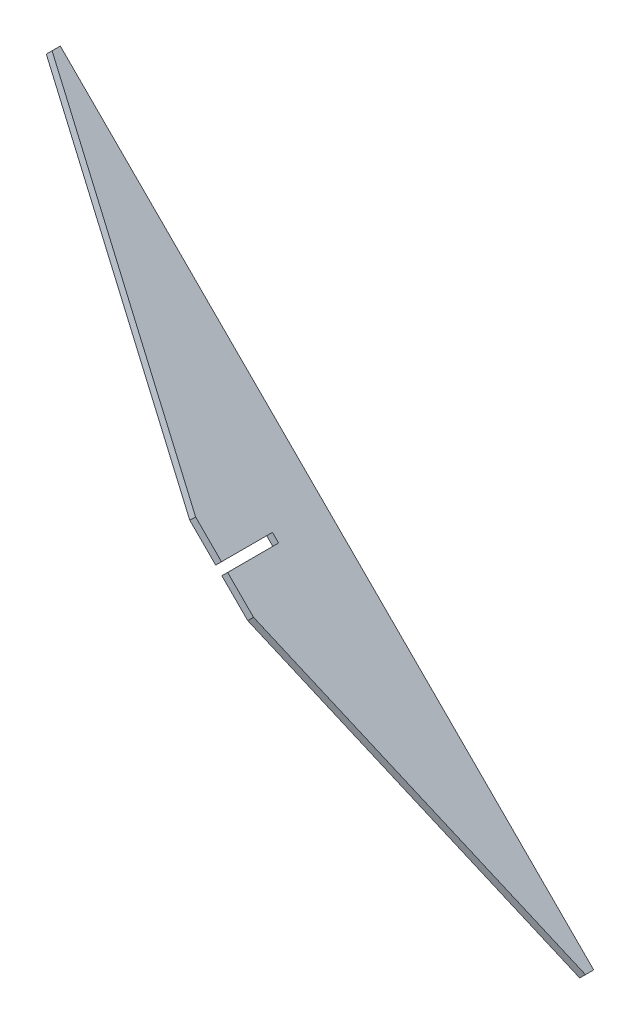
ISO-10303-21;
HEADER;
FILE_DESCRIPTION(('STEP AP214'),'2;1');
FILE_NAME('part.step','',(''),(''),'','','');
FILE_SCHEMA(('AUTOMOTIVE_DESIGN { 1 0 10303 214 1 1 1 1 }'));
ENDSEC;
DATA;
#1=APPLICATION_CONTEXT('core data for automotive mechanical design processes');
#2=APPLICATION_PROTOCOL_DEFINITION('international standard','automotive_design',2000,#1);
#3=PRODUCT_CONTEXT('',#1,'mechanical');
#4=PRODUCT('Part','Part','',(#3));
#5=PRODUCT_RELATED_PRODUCT_CATEGORY('part','',(#4));
#6=PRODUCT_DEFINITION_FORMATION('','',#4);
#7=PRODUCT_DEFINITION_CONTEXT('part definition',#1,'design');
#8=PRODUCT_DEFINITION('design','',#6,#7);
#9=PRODUCT_DEFINITION_SHAPE('','',#8);
#10=(LENGTH_UNIT() NAMED_UNIT(*) SI_UNIT(.MILLI.,.METRE.));
#11=(NAMED_UNIT(*) PLANE_ANGLE_UNIT() SI_UNIT($,.RADIAN.));
#12=(NAMED_UNIT(*) SI_UNIT($,.STERADIAN.) SOLID_ANGLE_UNIT());
#13=UNCERTAINTY_MEASURE_WITH_UNIT(LENGTH_MEASURE(1.E-05),#10,'distance_accuracy_value','');
#14=(GEOMETRIC_REPRESENTATION_CONTEXT(3) GLOBAL_UNCERTAINTY_ASSIGNED_CONTEXT((#13)) GLOBAL_UNIT_ASSIGNED_CONTEXT((#10,
#11,#12)) REPRESENTATION_CONTEXT('',''));
#15=CARTESIAN_POINT('',(0.,0.,0.));
#16=DIRECTION('',(0.,0.,1.));
#17=DIRECTION('',(1.,0.,0.));
#18=AXIS2_PLACEMENT_3D('',#15,#16,#17);
#19=CARTESIAN_POINT('',(-328.999999999999,476.499999999996,115.000000000005));
#20=DIRECTION('',(0.,0.,-1.));
#21=DIRECTION('',(1.,0.,0.));
#22=AXIS2_PLACEMENT_3D('',#19,#20,#21);
#23=PLANE('',#22);
#24=DIRECTION('',(0.707106781186548,-0.707106781186547,0.));
#25=VECTOR('',#24,1.);
#26=CARTESIAN_POINT('',(329.,7.07106781186552,115.000000000005));
#27=LINE('',#26,#25);
#28=CARTESIAN_POINT('',(7.28319984622133,328.787867965644,115.000000000005));
#29=VERTEX_POINT('',#28);
#30=CARTESIAN_POINT('',(38.8908729652601,297.180194846605,115.000000000005));
#31=VERTEX_POINT('',#30);
#32=EDGE_CURVE('E126',#29,#31,#27,.T.);
#33=ORIENTED_EDGE('',*,*,#32,.F.);
#34=DIRECTION('',(-0.707106781186547,-0.707106781186547,0.));
#35=VECTOR('',#34,1.);
#36=CARTESIAN_POINT('',(-87.0023340597134,234.502334059709,115.000000000005));
#37=LINE('',#36,#35);
#38=CARTESIAN_POINT('',(0.212132034355911,321.716800153779,115.000000000005));
#39=VERTEX_POINT('',#38);
#40=EDGE_CURVE('E11',#29,#39,#37,.T.);
#41=ORIENTED_EDGE('',*,*,#40,.T.);
#42=DIRECTION('',(-0.707106781186548,0.707106781186547,0.));
#43=VECTOR('',#42,1.);
#44=CARTESIAN_POINT('',(-329.,650.928932188135,115.000000000005));
#45=LINE('',#44,#43);
#46=CARTESIAN_POINT('',(31.8198051533946,290.10912703474,115.000000000005));
#47=VERTEX_POINT('',#46);
#48=EDGE_CURVE('E125',#47,#39,#45,.T.);
#49=ORIENTED_EDGE('',*,*,#48,.F.);
#50=DIRECTION('',(-0.707106781186548,-0.707106781186548,0.));
#51=VECTOR('',#50,1.);
#52=CARTESIAN_POINT('',(38.8908729652601,297.180194846605,115.000000000005));
#53=LINE('',#52,#51);
#54=EDGE_CURVE('E178',#31,#47,#53,.T.);
#55=ORIENTED_EDGE('',*,*,#54,.F.);
#56=EDGE_LOOP('',(#33,#41,#49,#55));
#57=FACE_BOUND('',#56,.T.);
#58=ADVANCED_FACE('F32',(#57),#23,.F.);
#59=CARTESIAN_POINT('',(329.,7.07106781186548,1170.5525240415));
#60=DIRECTION('',(-0.707106781186547,-0.707106781186548,0.));
#61=DIRECTION('',(0.707106781186548,-0.707106781186547,0.));
#62=AXIS2_PLACEMENT_3D('',#59,#60,#61);
#63=PLANE('',#62);
#64=DIRECTION('',(0.707106781186548,-0.707106781186547,0.));
#65=VECTOR('',#64,1.);
#66=CARTESIAN_POINT('',(329.,7.07106781186548,52.8000000000048));
#67=LINE('',#66,#65);
#68=CARTESIAN_POINT('',(-0.21213203435605,336.283199846222,52.8000000000049));
#69=VERTEX_POINT('',#68);
#70=CARTESIAN_POINT('',(7.28319984622136,328.787867965644,52.8000000000049));
#71=VERTEX_POINT('',#70);
#72=EDGE_CURVE('E173',#69,#71,#67,.T.);
#73=ORIENTED_EDGE('',*,*,#72,.T.);
#74=DIRECTION('',(0.,0.,1.));
#75=VECTOR('',#74,1.);
#76=CARTESIAN_POINT('',(7.28319984622133,328.787867965644,1170.5525240415));
#77=LINE('',#76,#75);
#78=EDGE_CURVE('E171',#71,#29,#77,.T.);
#79=ORIENTED_EDGE('',*,*,#78,.T.);
#80=ORIENTED_EDGE('',*,*,#32,.T.);
#81=DIRECTION('',(-0.680865515416172,0.680865515416172,0.269896831834207));
#82=VECTOR('',#81,1.);
#83=CARTESIAN_POINT('',(179.760877736731,156.310190075134,59.1587697901739));
#84=LINE('',#83,#82);
#85=CARTESIAN_POINT('',(329.,7.07106781186545,-9.63226588094599E-13));
#86=VERTEX_POINT('',#85);
#87=EDGE_CURVE('E176',#86,#31,#84,.T.);
#88=ORIENTED_EDGE('',*,*,#87,.F.);
#89=DIRECTION('',(0.,0.,-1.));
#90=VECTOR('',#89,1.);
#91=CARTESIAN_POINT('',(329.,7.07106781186548,1170.5525240415));
#92=LINE('',#91,#90);
#93=CARTESIAN_POINT('',(329.,7.07106781186548,-10.0000000000015));
#94=VERTEX_POINT('',#93);
#95=EDGE_CURVE('E140',#86,#94,#92,.T.);
#96=ORIENTED_EDGE('',*,*,#95,.T.);
#97=DIRECTION('',(-0.707106781186548,0.707106781186547,0.));
#98=VECTOR('',#97,1.);
#99=CARTESIAN_POINT('',(329.,7.07106781186545,-10.0000000000012));
#100=LINE('',#99,#98);
#101=CARTESIAN_POINT('',(-321.928932188135,658.,-10.0000000000012));
#102=VERTEX_POINT('',#101);
#103=EDGE_CURVE('E190',#94,#102,#100,.T.);
#104=ORIENTED_EDGE('',*,*,#103,.T.);
#105=DIRECTION('',(0.,0.,-1.));
#106=VECTOR('',#105,1.);
#107=CARTESIAN_POINT('',(-321.928932188135,658.,1170.5525240415));
#108=LINE('',#107,#106);
#109=CARTESIAN_POINT('',(-321.928932188135,658.,-1.22124532708767E-12));
#110=VERTEX_POINT('',#109);
#111=EDGE_CURVE('E137',#110,#102,#108,.T.);
#112=ORIENTED_EDGE('',*,*,#111,.F.);
#113=DIRECTION('',(0.680865515416171,-0.680865515416172,0.269896831834207));
#114=VECTOR('',#113,1.);
#115=CARTESIAN_POINT('',(132.344415429701,203.726652382164,180.075116939695));
#116=LINE('',#115,#114);
#117=CARTESIAN_POINT('',(-31.8198051533947,367.89087296526,115.000000000005));
#118=VERTEX_POINT('',#117);
#119=EDGE_CURVE('E156',#110,#118,#116,.T.);
#120=ORIENTED_EDGE('',*,*,#119,.T.);
#121=CARTESIAN_POINT('',(-0.212132034356077,336.283199846221,115.000000000005));
#122=VERTEX_POINT('',#121);
#123=EDGE_CURVE('E131',#118,#122,#27,.T.);
#124=ORIENTED_EDGE('',*,*,#123,.T.);
#125=DIRECTION('',(0.,0.,-1.));
#126=VECTOR('',#125,1.);
#127=CARTESIAN_POINT('',(-0.21213203435605,336.283199846221,1170.5525240415));
#128=LINE('',#127,#126);
#129=EDGE_CURVE('E47',#122,#69,#128,.T.);
#130=ORIENTED_EDGE('',*,*,#129,.T.);
#131=EDGE_LOOP('',(#73,#79,#80,#88,#96,#104,#112,#120,#124,#130));
#132=FACE_BOUND('',#131,.T.);
#133=ADVANCED_FACE('F154',(#132),#63,.F.);
#134=CARTESIAN_POINT('',(321.928932188135,0.,1170.5525240415));
#135=DIRECTION('',(-0.707106781186546,0.707106781186549,0.));
#136=DIRECTION('',(-0.707106781186549,-0.707106781186546,0.));
#137=AXIS2_PLACEMENT_3D('',#134,#135,#136);
#138=PLANE('',#137);
#139=DIRECTION('',(-0.707106781186548,-0.707106781186548,0.));
#140=VECTOR('',#139,1.);
#141=CARTESIAN_POINT('',(329.,7.07106781186545,-9.63226588094599E-13));
#142=LINE('',#141,#140);
#143=CARTESIAN_POINT('',(321.928932188135,0.,-9.63226588094599E-13));
#144=VERTEX_POINT('',#143);
#145=EDGE_CURVE('E180',#86,#144,#142,.T.);
#146=ORIENTED_EDGE('',*,*,#145,.T.);
#147=DIRECTION('',(0.,0.,-1.));
#148=VECTOR('',#147,1.);
#149=CARTESIAN_POINT('',(321.928932188135,0.,1170.5525240415));
#150=LINE('',#149,#148);
#151=CARTESIAN_POINT('',(321.928932188135,0.,-10.0000000000012));
#152=VERTEX_POINT('',#151);
#153=EDGE_CURVE('E142',#144,#152,#150,.T.);
#154=ORIENTED_EDGE('',*,*,#153,.T.);
#155=DIRECTION('',(0.707106781186549,0.707106781186546,0.));
#156=VECTOR('',#155,1.);
#157=CARTESIAN_POINT('',(321.928932188135,1.87725644557864E-13,-10.0000000000012));
#158=LINE('',#157,#156);
#159=EDGE_CURVE('E182',#152,#94,#158,.T.);
#160=ORIENTED_EDGE('',*,*,#159,.T.);
#161=ORIENTED_EDGE('',*,*,#95,.F.);
#162=EDGE_LOOP('',(#146,#154,#160,#161));
#163=FACE_BOUND('',#162,.T.);
#164=ADVANCED_FACE('F202',(#163),#138,.F.);
#165=CARTESIAN_POINT('',(-329.,650.928932188135,1170.5525240415));
#166=DIRECTION('',(0.707106781186547,0.707106781186548,0.));
#167=DIRECTION('',(-0.707106781186548,0.707106781186547,0.));
#168=AXIS2_PLACEMENT_3D('',#165,#166,#167);
#169=PLANE('',#168);
#170=ORIENTED_EDGE('',*,*,#48,.T.);
#171=DIRECTION('',(0.,0.,1.));
#172=VECTOR('',#171,1.);
#173=CARTESIAN_POINT('',(0.212132034355911,321.716800153779,115.000000000005));
#174=LINE('',#173,#172);
#175=CARTESIAN_POINT('',(0.212132034355911,321.716800153779,52.8000000000049));
#176=VERTEX_POINT('',#175);
#177=EDGE_CURVE('E111',#176,#39,#174,.T.);
#178=ORIENTED_EDGE('',*,*,#177,.F.);
#179=DIRECTION('',(0.707106781186549,-0.707106781186546,0.));
#180=VECTOR('',#179,1.);
#181=CARTESIAN_POINT('',(-7.2831998462215,329.212132034356,52.8000000000049));
#182=LINE('',#181,#180);
#183=CARTESIAN_POINT('',(-7.2831998462215,329.212132034356,52.8000000000049));
#184=VERTEX_POINT('',#183);
#185=EDGE_CURVE('E163',#184,#176,#182,.T.);
#186=ORIENTED_EDGE('',*,*,#185,.F.);
#187=DIRECTION('',(0.,0.,-1.));
#188=VECTOR('',#187,1.);
#189=CARTESIAN_POINT('',(-7.2831998462215,329.212132034356,115.000000000005));
#190=LINE('',#189,#188);
#191=CARTESIAN_POINT('',(-7.2831998462215,329.212132034356,115.000000000005));
#192=VERTEX_POINT('',#191);
#193=EDGE_CURVE('E119',#192,#184,#190,.T.);
#194=ORIENTED_EDGE('',*,*,#193,.F.);
#195=CARTESIAN_POINT('',(-38.8908729652604,360.819805153395,115.000000000005));
#196=VERTEX_POINT('',#195);
#197=EDGE_CURVE('E55',#192,#196,#45,.T.);
#198=ORIENTED_EDGE('',*,*,#197,.T.);
#199=DIRECTION('',(0.680865515416171,-0.680865515416172,0.269896831834207));
#200=VECTOR('',#199,1.);
#201=CARTESIAN_POINT('',(125.273347617836,196.655584570299,180.075116939695));
#202=LINE('',#201,#200);
#203=CARTESIAN_POINT('',(-329.,650.928932188135,-1.22124532708767E-12));
#204=VERTEX_POINT('',#203);
#205=EDGE_CURVE('E175',#204,#196,#202,.T.);
#206=ORIENTED_EDGE('',*,*,#205,.F.);
#207=DIRECTION('',(0.,0.,-1.));
#208=VECTOR('',#207,1.);
#209=CARTESIAN_POINT('',(-329.,650.928932188135,1170.5525240415));
#210=LINE('',#209,#208);
#211=CARTESIAN_POINT('',(-329.,650.928932188135,-10.0000000000012));
#212=VERTEX_POINT('',#211);
#213=EDGE_CURVE('E135',#204,#212,#210,.T.);
#214=ORIENTED_EDGE('',*,*,#213,.T.);
#215=DIRECTION('',(0.707106781186548,-0.707106781186547,0.));
#216=VECTOR('',#215,1.);
#217=CARTESIAN_POINT('',(-329.,650.928932188135,-10.0000000000012));
#218=LINE('',#217,#216);
#219=EDGE_CURVE('E138',#212,#152,#218,.T.);
#220=ORIENTED_EDGE('',*,*,#219,.T.);
#221=ORIENTED_EDGE('',*,*,#153,.F.);
#222=DIRECTION('',(-0.680865515416172,0.680865515416172,0.269896831834207));
#223=VECTOR('',#222,1.);
#224=CARTESIAN_POINT('',(172.689809924866,149.239122263269,59.1587697901739));
#225=LINE('',#224,#223);
#226=EDGE_CURVE('E129',#144,#47,#225,.T.);
#227=ORIENTED_EDGE('',*,*,#226,.T.);
#228=EDGE_LOOP('',(#170,#178,#186,#194,#198,#206,#214,#220,#221,#227));
#229=FACE_BOUND('',#228,.T.);
#230=ADVANCED_FACE('F34',(#229),#169,.F.);
#231=ORIENTED_EDGE('',*,*,#197,.F.);
#232=DIRECTION('',(0.707106781186547,0.707106781186547,0.));
#233=VECTOR('',#232,1.);
#234=CARTESIAN_POINT('',(-94.4976659402907,241.997665940287,115.000000000005));
#235=LINE('',#234,#233);
#236=EDGE_CURVE('E40',#192,#122,#235,.T.);
#237=ORIENTED_EDGE('',*,*,#236,.T.);
#238=ORIENTED_EDGE('',*,*,#123,.F.);
#239=DIRECTION('',(-0.707106781186548,-0.707106781186548,0.));
#240=VECTOR('',#239,1.);
#241=CARTESIAN_POINT('',(-31.8198051533947,367.89087296526,115.000000000005));
#242=LINE('',#241,#240);
#243=EDGE_CURVE('E160',#118,#196,#242,.T.);
#244=ORIENTED_EDGE('',*,*,#243,.T.);
#245=EDGE_LOOP('',(#231,#237,#238,#244));
#246=FACE_BOUND('',#245,.T.);
#247=ADVANCED_FACE('F159',(#246),#23,.F.);
#248=CARTESIAN_POINT('',(-329.,650.928932188135,1170.5525240415));
#249=DIRECTION('',(0.707106781186548,-0.707106781186548,0.));
#250=DIRECTION('',(0.707106781186548,0.707106781186548,0.));
#251=AXIS2_PLACEMENT_3D('',#248,#249,#250);
#252=PLANE('',#251);
#253=ORIENTED_EDGE('',*,*,#213,.F.);
#254=DIRECTION('',(-0.707106781186548,-0.707106781186548,0.));
#255=VECTOR('',#254,1.);
#256=CARTESIAN_POINT('',(-321.928932188135,658.,-1.22124532708767E-12));
#257=LINE('',#256,#255);
#258=EDGE_CURVE('E185',#110,#204,#257,.T.);
#259=ORIENTED_EDGE('',*,*,#258,.F.);
#260=ORIENTED_EDGE('',*,*,#111,.T.);
#261=DIRECTION('',(-0.707106781186547,-0.707106781186547,0.));
#262=VECTOR('',#261,1.);
#263=CARTESIAN_POINT('',(-329.,650.928932188135,-10.0000000000012));
#264=LINE('',#263,#262);
#265=EDGE_CURVE('E193',#102,#212,#264,.T.);
#266=ORIENTED_EDGE('',*,*,#265,.T.);
#267=EDGE_LOOP('',(#253,#259,#260,#266));
#268=FACE_BOUND('',#267,.T.);
#269=ADVANCED_FACE('F206',(#268),#252,.F.);
#270=CARTESIAN_POINT('',(-302.5,658.000000000053,-10.0000000000012));
#271=DIRECTION('',(0.,0.,-1.));
#272=DIRECTION('',(0.,-1.,0.));
#273=AXIS2_PLACEMENT_3D('',#270,#271,#272);
#274=PLANE('',#273);
#275=ORIENTED_EDGE('',*,*,#219,.F.);
#276=ORIENTED_EDGE('',*,*,#265,.F.);
#277=ORIENTED_EDGE('',*,*,#103,.F.);
#278=ORIENTED_EDGE('',*,*,#159,.F.);
#279=EDGE_LOOP('',(#275,#276,#277,#278));
#280=FACE_BOUND('',#279,.T.);
#281=ADVANCED_FACE('F201',(#280),#274,.T.);
#282=CARTESIAN_POINT('',(132.344415429701,203.726652382164,180.075116939695));
#283=DIRECTION('',(0.190845880010733,-0.190845880010733,-0.962889246053697));
#284=DIRECTION('',(-0.980918515536979,0.,-0.194419304280024));
#285=AXIS2_PLACEMENT_3D('',#282,#283,#284);
#286=PLANE('',#285);
#287=ORIENTED_EDGE('',*,*,#205,.T.);
#288=ORIENTED_EDGE('',*,*,#243,.F.);
#289=ORIENTED_EDGE('',*,*,#119,.F.);
#290=ORIENTED_EDGE('',*,*,#258,.T.);
#291=EDGE_LOOP('',(#287,#288,#289,#290));
#292=FACE_BOUND('',#291,.T.);
#293=ADVANCED_FACE('F209',(#292),#286,.F.);
#294=CARTESIAN_POINT('',(179.760877736731,156.310190075134,59.1587697901739));
#295=DIRECTION('',(0.190845880010733,-0.190845880010733,0.962889246053698));
#296=DIRECTION('',(0.98091851553698,0.,-0.194419304280024));
#297=AXIS2_PLACEMENT_3D('',#294,#295,#296);
#298=PLANE('',#297);
#299=ORIENTED_EDGE('',*,*,#226,.F.);
#300=ORIENTED_EDGE('',*,*,#145,.F.);
#301=ORIENTED_EDGE('',*,*,#87,.T.);
#302=ORIENTED_EDGE('',*,*,#54,.T.);
#303=EDGE_LOOP('',(#299,#300,#301,#302));
#304=FACE_BOUND('',#303,.T.);
#305=ADVANCED_FACE('F211',(#304),#298,.T.);
#306=CARTESIAN_POINT('',(325.252334059712,661.747665940289,52.8000000000049));
#307=DIRECTION('',(0.,0.,-1.));
#308=DIRECTION('',(-1.,0.,0.));
#309=AXIS2_PLACEMENT_3D('',#306,#307,#308);
#310=PLANE('',#309);
#311=DIRECTION('',(-0.707106781186547,-0.707106781186547,0.));
#312=VECTOR('',#311,1.);
#313=CARTESIAN_POINT('',(325.252334059712,661.747665940289,52.8000000000049));
#314=LINE('',#313,#312);
#315=EDGE_CURVE('E165',#69,#184,#314,.T.);
#316=ORIENTED_EDGE('',*,*,#315,.T.);
#317=ORIENTED_EDGE('',*,*,#185,.T.);
#318=DIRECTION('',(-0.707106781186547,-0.707106781186547,0.));
#319=VECTOR('',#318,1.);
#320=CARTESIAN_POINT('',(332.747665940289,654.252334059712,52.8000000000049));
#321=LINE('',#320,#319);
#322=EDGE_CURVE('E115',#71,#176,#321,.T.);
#323=ORIENTED_EDGE('',*,*,#322,.F.);
#324=ORIENTED_EDGE('',*,*,#72,.F.);
#325=EDGE_LOOP('',(#316,#317,#323,#324));
#326=FACE_BOUND('',#325,.T.);
#327=ADVANCED_FACE('F217',(#326),#310,.F.);
#328=CARTESIAN_POINT('',(332.747665940289,654.252334059712,115.000000000005));
#329=DIRECTION('',(0.707106781186547,-0.707106781186547,0.));
#330=DIRECTION('',(0.707106781186548,0.707106781186548,0.));
#331=AXIS2_PLACEMENT_3D('',#328,#329,#330);
#332=PLANE('',#331);
#333=ORIENTED_EDGE('',*,*,#322,.T.);
#334=ORIENTED_EDGE('',*,*,#177,.T.);
#335=ORIENTED_EDGE('',*,*,#40,.F.);
#336=ORIENTED_EDGE('',*,*,#78,.F.);
#337=EDGE_LOOP('',(#333,#334,#335,#336));
#338=FACE_BOUND('',#337,.T.);
#339=ADVANCED_FACE('F112',(#338),#332,.F.);
#340=CARTESIAN_POINT('',(325.252334059712,661.747665940289,115.000000000005));
#341=DIRECTION('',(-0.707106781186547,0.707106781186547,0.));
#342=DIRECTION('',(-0.707106781186548,-0.707106781186548,0.));
#343=AXIS2_PLACEMENT_3D('',#340,#341,#342);
#344=PLANE('',#343);
#345=ORIENTED_EDGE('',*,*,#236,.F.);
#346=ORIENTED_EDGE('',*,*,#193,.T.);
#347=ORIENTED_EDGE('',*,*,#315,.F.);
#348=ORIENTED_EDGE('',*,*,#129,.F.);
#349=EDGE_LOOP('',(#345,#346,#347,#348));
#350=FACE_BOUND('',#349,.T.);
#351=ADVANCED_FACE('F162',(#350),#344,.F.);
#352=CLOSED_SHELL('',(#58,#133,#164,#230,#247,#269,#281,#293,#305,#327,#339,#351));
#353=MANIFOLD_SOLID_BREP('B2',#352);
#354=ADVANCED_BREP_SHAPE_REPRESENTATION('',(#18,#353),#14);
#355=SHAPE_DEFINITION_REPRESENTATION(#9,#354);
ENDSEC;
END-ISO-10303-21;
